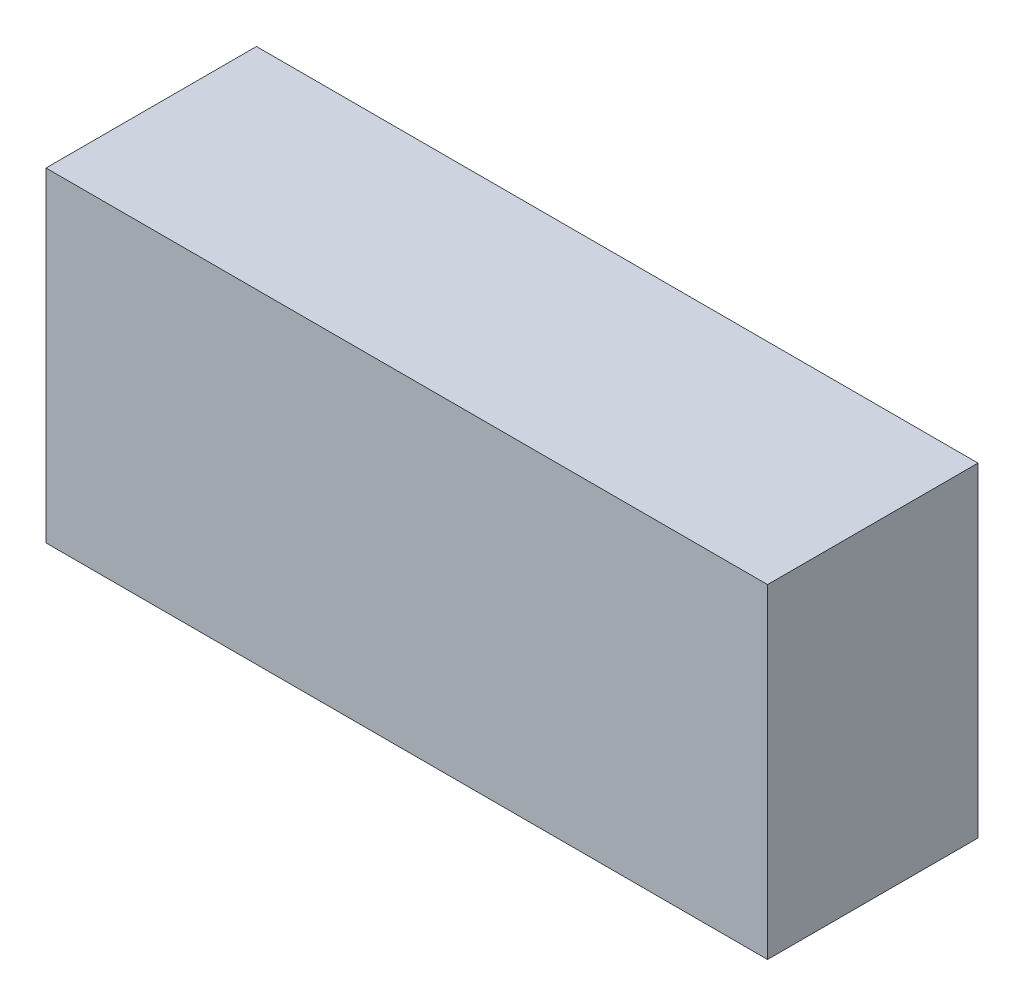
ISO-10303-21;
HEADER;
FILE_DESCRIPTION(('STEP AP214'),'2;1');
FILE_NAME('part.step','',(''),(''),'','','');
FILE_SCHEMA(('AUTOMOTIVE_DESIGN { 1 0 10303 214 1 1 1 1 }'));
ENDSEC;
DATA;
#1=APPLICATION_CONTEXT('core data for automotive mechanical design processes');
#2=APPLICATION_PROTOCOL_DEFINITION('international standard','automotive_design',2000,#1);
#3=PRODUCT_CONTEXT('',#1,'mechanical');
#4=PRODUCT('Part','Part','',(#3));
#5=PRODUCT_RELATED_PRODUCT_CATEGORY('part','',(#4));
#6=PRODUCT_DEFINITION_FORMATION('','',#4);
#7=PRODUCT_DEFINITION_CONTEXT('part definition',#1,'design');
#8=PRODUCT_DEFINITION('design','',#6,#7);
#9=PRODUCT_DEFINITION_SHAPE('','',#8);
#10=(LENGTH_UNIT() NAMED_UNIT(*) SI_UNIT(.MILLI.,.METRE.));
#11=(NAMED_UNIT(*) PLANE_ANGLE_UNIT() SI_UNIT($,.RADIAN.));
#12=(NAMED_UNIT(*) SI_UNIT($,.STERADIAN.) SOLID_ANGLE_UNIT());
#13=UNCERTAINTY_MEASURE_WITH_UNIT(LENGTH_MEASURE(1.E-05),#10,'distance_accuracy_value','');
#14=(GEOMETRIC_REPRESENTATION_CONTEXT(3) GLOBAL_UNCERTAINTY_ASSIGNED_CONTEXT((#13)) GLOBAL_UNIT_ASSIGNED_CONTEXT((#10,
#11,#12)) REPRESENTATION_CONTEXT('',''));
#15=CARTESIAN_POINT('',(0.,0.,0.));
#16=DIRECTION('',(0.,0.,1.));
#17=DIRECTION('',(1.,0.,0.));
#18=AXIS2_PLACEMENT_3D('',#15,#16,#17);
#19=CARTESIAN_POINT('',(-73.0527974012049,54.,33.4855111576465));
#20=DIRECTION('',(1.,0.,0.));
#21=DIRECTION('',(0.,0.,-1.));
#22=AXIS2_PLACEMENT_3D('',#19,#20,#21);
#23=PLANE('',#22);
#24=DIRECTION('',(0.,0.,1.));
#25=VECTOR('',#24,1.);
#26=CARTESIAN_POINT('',(-73.0527974012049,0.,33.4855111576465));
#27=LINE('',#26,#25);
#28=CARTESIAN_POINT('',(-73.0527974012049,0.,-1.51448884235347));
#29=VERTEX_POINT('',#28);
#30=CARTESIAN_POINT('',(-73.0527974012049,0.,33.4855111576465));
#31=VERTEX_POINT('',#30);
#32=EDGE_CURVE('E95',#29,#31,#27,.T.);
#33=ORIENTED_EDGE('',*,*,#32,.T.);
#34=DIRECTION('',(0.,-1.,0.));
#35=VECTOR('',#34,1.);
#36=CARTESIAN_POINT('',(-73.0527974012049,54.,33.4855111576465));
#37=LINE('',#36,#35);
#38=CARTESIAN_POINT('',(-73.0527974012049,54.,33.4855111576465));
#39=VERTEX_POINT('',#38);
#40=EDGE_CURVE('E11',#39,#31,#37,.T.);
#41=ORIENTED_EDGE('',*,*,#40,.F.);
#42=DIRECTION('',(0.,0.,1.));
#43=VECTOR('',#42,1.);
#44=CARTESIAN_POINT('',(-73.0527974012049,54.,33.4855111576465));
#45=LINE('',#44,#43);
#46=CARTESIAN_POINT('',(-73.0527974012049,54.,-1.51448884235347));
#47=VERTEX_POINT('',#46);
#48=EDGE_CURVE('E83',#47,#39,#45,.T.);
#49=ORIENTED_EDGE('',*,*,#48,.F.);
#50=DIRECTION('',(0.,-1.,0.));
#51=VECTOR('',#50,1.);
#52=CARTESIAN_POINT('',(-73.0527974012049,54.,-1.51448884235347));
#53=LINE('',#52,#51);
#54=EDGE_CURVE('E91',#47,#29,#53,.T.);
#55=ORIENTED_EDGE('',*,*,#54,.T.);
#56=EDGE_LOOP('',(#33,#41,#49,#55));
#57=FACE_BOUND('',#56,.T.);
#58=ADVANCED_FACE('F32',(#57),#23,.F.);
#59=CARTESIAN_POINT('',(-73.0527974012049,54.,33.4855111576465));
#60=DIRECTION('',(0.,0.,-1.));
#61=DIRECTION('',(-1.,0.,0.));
#62=AXIS2_PLACEMENT_3D('',#59,#60,#61);
#63=PLANE('',#62);
#64=DIRECTION('',(1.,0.,0.));
#65=VECTOR('',#64,1.);
#66=CARTESIAN_POINT('',(-73.0527974012049,0.,33.4855111576465));
#67=LINE('',#66,#65);
#68=CARTESIAN_POINT('',(46.9472025987951,0.,33.4855111576465));
#69=VERTEX_POINT('',#68);
#70=EDGE_CURVE('E87',#31,#69,#67,.T.);
#71=ORIENTED_EDGE('',*,*,#70,.T.);
#72=DIRECTION('',(0.,-1.,0.));
#73=VECTOR('',#72,1.);
#74=CARTESIAN_POINT('',(46.9472025987951,54.,33.4855111576465));
#75=LINE('',#74,#73);
#76=CARTESIAN_POINT('',(46.9472025987951,54.,33.4855111576465));
#77=VERTEX_POINT('',#76);
#78=EDGE_CURVE('E40',#77,#69,#75,.T.);
#79=ORIENTED_EDGE('',*,*,#78,.F.);
#80=DIRECTION('',(1.,0.,0.));
#81=VECTOR('',#80,1.);
#82=CARTESIAN_POINT('',(-73.0527974012049,54.,33.4855111576465));
#83=LINE('',#82,#81);
#84=EDGE_CURVE('E78',#39,#77,#83,.T.);
#85=ORIENTED_EDGE('',*,*,#84,.F.);
#86=ORIENTED_EDGE('',*,*,#40,.T.);
#87=EDGE_LOOP('',(#71,#79,#85,#86));
#88=FACE_BOUND('',#87,.T.);
#89=ADVANCED_FACE('F86',(#88),#63,.F.);
#90=CARTESIAN_POINT('',(46.9472025987951,54.,33.4855111576465));
#91=DIRECTION('',(-1.,0.,0.));
#92=DIRECTION('',(0.,0.,1.));
#93=AXIS2_PLACEMENT_3D('',#90,#91,#92);
#94=PLANE('',#93);
#95=DIRECTION('',(0.,0.,-1.));
#96=VECTOR('',#95,1.);
#97=CARTESIAN_POINT('',(46.9472025987951,0.,33.4855111576465));
#98=LINE('',#97,#96);
#99=CARTESIAN_POINT('',(46.9472025987951,0.,-1.51448884235347));
#100=VERTEX_POINT('',#99);
#101=EDGE_CURVE('E65',#69,#100,#98,.T.);
#102=ORIENTED_EDGE('',*,*,#101,.T.);
#103=DIRECTION('',(0.,-1.,0.));
#104=VECTOR('',#103,1.);
#105=CARTESIAN_POINT('',(46.9472025987951,54.,-1.51448884235347));
#106=LINE('',#105,#104);
#107=CARTESIAN_POINT('',(46.9472025987951,54.,-1.51448884235347));
#108=VERTEX_POINT('',#107);
#109=EDGE_CURVE('E88',#108,#100,#106,.T.);
#110=ORIENTED_EDGE('',*,*,#109,.F.);
#111=DIRECTION('',(0.,0.,-1.));
#112=VECTOR('',#111,1.);
#113=CARTESIAN_POINT('',(46.9472025987951,54.,33.4855111576465));
#114=LINE('',#113,#112);
#115=EDGE_CURVE('E81',#77,#108,#114,.T.);
#116=ORIENTED_EDGE('',*,*,#115,.F.);
#117=ORIENTED_EDGE('',*,*,#78,.T.);
#118=EDGE_LOOP('',(#102,#110,#116,#117));
#119=FACE_BOUND('',#118,.T.);
#120=ADVANCED_FACE('F89',(#119),#94,.F.);
#121=CARTESIAN_POINT('',(-73.0527974012049,54.,-1.51448884235347));
#122=DIRECTION('',(0.,0.,1.));
#123=DIRECTION('',(1.,0.,0.));
#124=AXIS2_PLACEMENT_3D('',#121,#122,#123);
#125=PLANE('',#124);
#126=DIRECTION('',(-1.,0.,0.));
#127=VECTOR('',#126,1.);
#128=CARTESIAN_POINT('',(-73.0527974012049,0.,-1.51448884235347));
#129=LINE('',#128,#127);
#130=EDGE_CURVE('E71',#100,#29,#129,.T.);
#131=ORIENTED_EDGE('',*,*,#130,.T.);
#132=ORIENTED_EDGE('',*,*,#54,.F.);
#133=DIRECTION('',(-1.,0.,0.));
#134=VECTOR('',#133,1.);
#135=CARTESIAN_POINT('',(-73.0527974012049,54.,-1.51448884235347));
#136=LINE('',#135,#134);
#137=EDGE_CURVE('E48',#108,#47,#136,.T.);
#138=ORIENTED_EDGE('',*,*,#137,.F.);
#139=ORIENTED_EDGE('',*,*,#109,.T.);
#140=EDGE_LOOP('',(#131,#132,#138,#139));
#141=FACE_BOUND('',#140,.T.);
#142=ADVANCED_FACE('F102',(#141),#125,.F.);
#143=CARTESIAN_POINT('',(0.,54.,0.));
#144=DIRECTION('',(0.,-1.,0.));
#145=DIRECTION('',(0.,0.,-1.));
#146=AXIS2_PLACEMENT_3D('',#143,#144,#145);
#147=PLANE('',#146);
#148=ORIENTED_EDGE('',*,*,#48,.T.);
#149=ORIENTED_EDGE('',*,*,#84,.T.);
#150=ORIENTED_EDGE('',*,*,#115,.T.);
#151=ORIENTED_EDGE('',*,*,#137,.T.);
#152=EDGE_LOOP('',(#148,#149,#150,#151));
#153=FACE_BOUND('',#152,.T.);
#154=ADVANCED_FACE('F79',(#153),#147,.F.);
#155=CARTESIAN_POINT('',(0.,0.,0.));
#156=DIRECTION('',(0.,-1.,0.));
#157=DIRECTION('',(0.,0.,-1.));
#158=AXIS2_PLACEMENT_3D('',#155,#156,#157);
#159=PLANE('',#158);
#160=ORIENTED_EDGE('',*,*,#32,.F.);
#161=ORIENTED_EDGE('',*,*,#130,.F.);
#162=ORIENTED_EDGE('',*,*,#101,.F.);
#163=ORIENTED_EDGE('',*,*,#70,.F.);
#164=EDGE_LOOP('',(#160,#161,#162,#163));
#165=FACE_BOUND('',#164,.T.);
#166=ADVANCED_FACE('F105',(#165),#159,.T.);
#167=CLOSED_SHELL('',(#58,#89,#120,#142,#154,#166));
#168=MANIFOLD_SOLID_BREP('B2',#167);
#169=ADVANCED_BREP_SHAPE_REPRESENTATION('',(#18,#168),#14);
#170=SHAPE_DEFINITION_REPRESENTATION(#9,#169);
ENDSEC;
END-ISO-10303-21;
